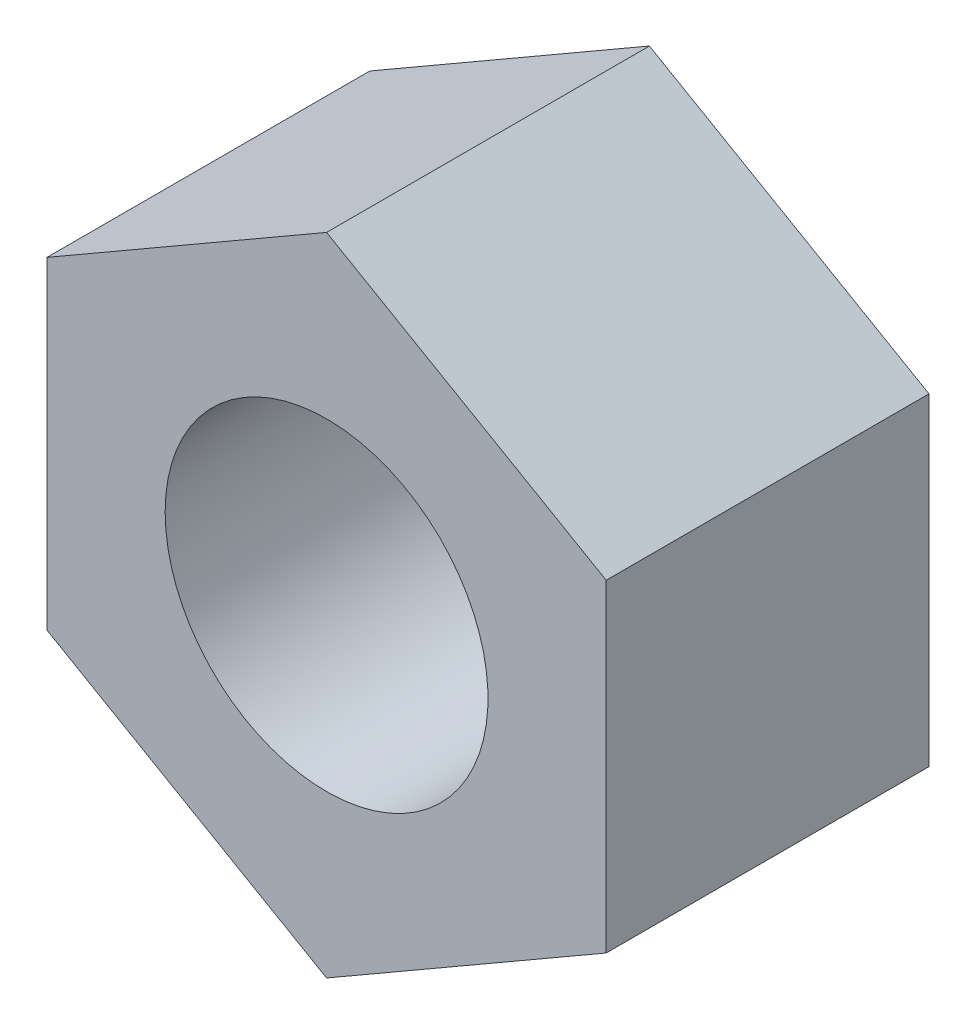
ISO-10303-21;
HEADER;
FILE_DESCRIPTION(('STEP AP214'),'2;1');
FILE_NAME('part.step','',(''),(''),'','','');
FILE_SCHEMA(('AUTOMOTIVE_DESIGN { 1 0 10303 214 1 1 1 1 }'));
ENDSEC;
DATA;
#1=APPLICATION_CONTEXT('core data for automotive mechanical design processes');
#2=APPLICATION_PROTOCOL_DEFINITION('international standard','automotive_design',2000,#1);
#3=PRODUCT_CONTEXT('',#1,'mechanical');
#4=PRODUCT('Part','Part','',(#3));
#5=PRODUCT_RELATED_PRODUCT_CATEGORY('part','',(#4));
#6=PRODUCT_DEFINITION_FORMATION('','',#4);
#7=PRODUCT_DEFINITION_CONTEXT('part definition',#1,'design');
#8=PRODUCT_DEFINITION('design','',#6,#7);
#9=PRODUCT_DEFINITION_SHAPE('','',#8);
#10=(LENGTH_UNIT() NAMED_UNIT(*) SI_UNIT(.MILLI.,.METRE.));
#11=(NAMED_UNIT(*) PLANE_ANGLE_UNIT() SI_UNIT($,.RADIAN.));
#12=(NAMED_UNIT(*) SI_UNIT($,.STERADIAN.) SOLID_ANGLE_UNIT());
#13=UNCERTAINTY_MEASURE_WITH_UNIT(LENGTH_MEASURE(1.E-05),#10,'distance_accuracy_value','');
#14=(GEOMETRIC_REPRESENTATION_CONTEXT(3) GLOBAL_UNCERTAINTY_ASSIGNED_CONTEXT((#13)) GLOBAL_UNIT_ASSIGNED_CONTEXT((#10,
#11,#12)) REPRESENTATION_CONTEXT('',''));
#15=CARTESIAN_POINT('',(0.,0.,0.));
#16=DIRECTION('',(0.,0.,1.));
#17=DIRECTION('',(1.,0.,0.));
#18=AXIS2_PLACEMENT_3D('',#15,#16,#17);
#19=CARTESIAN_POINT('',(-2.598076211,-3.036,3.));
#20=DIRECTION('',(0.,0.,1.));
#21=DIRECTION('',(1.,0.,0.));
#22=AXIS2_PLACEMENT_3D('',#19,#20,#21);
#23=PLANE('',#22);
#24=DIRECTION('',(0.,1.,0.));
#25=VECTOR('',#24,1.);
#26=CARTESIAN_POINT('',(-2.598076211,-1.5,3.));
#27=LINE('',#26,#25);
#28=CARTESIAN_POINT('',(-2.59807621108054,1.4999999998605,3.));
#29=VERTEX_POINT('',#28);
#30=CARTESIAN_POINT('',(-2.598076211,-1.499999999721,3.));
#31=VERTEX_POINT('',#30);
#32=EDGE_CURVE('E113',#29,#31,#27,.F.);
#33=ORIENTED_EDGE('',*,*,#32,.T.);
#34=DIRECTION('',(-0.866025403754996,0.500000000050997,0.));
#35=VECTOR('',#34,1.);
#36=CARTESIAN_POINT('',(0.,-3.,3.));
#37=LINE('',#36,#35);
#38=CARTESIAN_POINT('',(-3.22161380455283E-10,-2.9999999995815,3.));
#39=VERTEX_POINT('',#38);
#40=EDGE_CURVE('E108',#31,#39,#37,.F.);
#41=ORIENTED_EDGE('',*,*,#40,.T.);
#42=DIRECTION('',(-0.866025403754996,-0.500000000050997,0.));
#43=VECTOR('',#42,1.);
#44=CARTESIAN_POINT('',(2.598076211,-1.5,3.));
#45=LINE('',#44,#43);
#46=CARTESIAN_POINT('',(2.59807621108054,-1.4999999998605,3.));
#47=VERTEX_POINT('',#46);
#48=EDGE_CURVE('E103',#39,#47,#45,.F.);
#49=ORIENTED_EDGE('',*,*,#48,.T.);
#50=DIRECTION('',(0.,1.,0.));
#51=VECTOR('',#50,1.);
#52=CARTESIAN_POINT('',(2.598076211,1.5,3.));
#53=LINE('',#52,#51);
#54=CARTESIAN_POINT('',(2.598076211,1.499999999721,3.));
#55=VERTEX_POINT('',#54);
#56=EDGE_CURVE('E72',#47,#55,#53,.T.);
#57=ORIENTED_EDGE('',*,*,#56,.T.);
#58=DIRECTION('',(0.866025403754996,-0.500000000050997,0.));
#59=VECTOR('',#58,1.);
#60=CARTESIAN_POINT('',(0.,3.,3.));
#61=LINE('',#60,#59);
#62=CARTESIAN_POINT('',(3.22161554575826E-10,2.9999999995815,3.));
#63=VERTEX_POINT('',#62);
#64=EDGE_CURVE('E70',#55,#63,#61,.F.);
#65=ORIENTED_EDGE('',*,*,#64,.T.);
#66=DIRECTION('',(0.866025403754996,0.500000000050997,0.));
#67=VECTOR('',#66,1.);
#68=CARTESIAN_POINT('',(-2.598076211,1.5,3.));
#69=LINE('',#68,#67);
#70=EDGE_CURVE('E67',#63,#29,#69,.F.);
#71=ORIENTED_EDGE('',*,*,#70,.T.);
#72=EDGE_LOOP('',(#33,#41,#49,#57,#65,#71));
#73=FACE_BOUND('',#72,.T.);
#74=CARTESIAN_POINT('',(0.,0.,3.));
#75=DIRECTION('',(0.,0.,-1.));
#76=DIRECTION('',(-1.,0.,0.));
#77=AXIS2_PLACEMENT_3D('',#74,#75,#76);
#78=CIRCLE('',#77,1.5);
#79=CARTESIAN_POINT('',(-1.5,0.,3.));
#80=VERTEX_POINT('',#79);
#81=EDGE_CURVE('E20',#80,#80,#78,.T.);
#82=ORIENTED_EDGE('',*,*,#81,.T.);
#83=EDGE_LOOP('',(#82));
#84=FACE_BOUND('',#83,.T.);
#85=ADVANCED_FACE('F17',(#73,#84),#23,.T.);
#86=CARTESIAN_POINT('',(0.,0.,3.));
#87=DIRECTION('',(0.,0.,-1.));
#88=DIRECTION('',(-1.,0.,0.));
#89=AXIS2_PLACEMENT_3D('',#86,#87,#88);
#90=CYLINDRICAL_SURFACE('',#89,1.5);
#91=ORIENTED_EDGE('',*,*,#81,.F.);
#92=EDGE_LOOP('',(#91));
#93=FACE_BOUND('',#92,.T.);
#94=CARTESIAN_POINT('',(0.,0.,0.));
#95=DIRECTION('',(0.,0.,-1.));
#96=DIRECTION('',(-1.,0.,0.));
#97=AXIS2_PLACEMENT_3D('',#94,#95,#96);
#98=CIRCLE('',#97,1.5);
#99=CARTESIAN_POINT('',(-1.5,0.,0.));
#100=VERTEX_POINT('',#99);
#101=EDGE_CURVE('E91',#100,#100,#98,.T.);
#102=ORIENTED_EDGE('',*,*,#101,.T.);
#103=EDGE_LOOP('',(#102));
#104=FACE_BOUND('',#103,.T.);
#105=ADVANCED_FACE('F154',(#93,#104),#90,.F.);
#106=CARTESIAN_POINT('',(0.,3.,0.));
#107=DIRECTION('',(-0.500000000050997,-0.866025403754996,0.));
#108=DIRECTION('',(0.866025403754996,-0.500000000050997,0.));
#109=AXIS2_PLACEMENT_3D('',#106,#107,#108);
#110=PLANE('',#109);
#111=ORIENTED_EDGE('',*,*,#64,.F.);
#112=DIRECTION('',(0.,0.,1.));
#113=VECTOR('',#112,1.);
#114=CARTESIAN_POINT('',(2.598076211,1.499999999628,0.));
#115=LINE('',#114,#113);
#116=CARTESIAN_POINT('',(2.598076211,1.499999999907,0.));
#117=VERTEX_POINT('',#116);
#118=EDGE_CURVE('E93',#55,#117,#115,.F.);
#119=ORIENTED_EDGE('',*,*,#118,.T.);
#120=DIRECTION('',(-0.866025403754996,0.500000000050997,0.));
#121=VECTOR('',#120,1.);
#122=CARTESIAN_POINT('',(2.598076211,1.5,0.));
#123=LINE('',#122,#121);
#124=CARTESIAN_POINT('',(2.81891331438794E-10,2.99999999983725,0.));
#125=VERTEX_POINT('',#124);
#126=EDGE_CURVE('E88',#117,#125,#123,.T.);
#127=ORIENTED_EDGE('',*,*,#126,.T.);
#128=DIRECTION('',(0.,0.,1.));
#129=VECTOR('',#128,1.);
#130=CARTESIAN_POINT('',(0.,3.,0.));
#131=LINE('',#130,#129);
#132=EDGE_CURVE('E77',#125,#63,#131,.T.);
#133=ORIENTED_EDGE('',*,*,#132,.T.);
#134=EDGE_LOOP('',(#111,#119,#127,#133));
#135=FACE_BOUND('',#134,.T.);
#136=ADVANCED_FACE('F87',(#135),#110,.F.);
#137=CARTESIAN_POINT('',(-2.598076211,1.5,0.));
#138=DIRECTION('',(0.500000000050997,-0.866025403754996,0.));
#139=DIRECTION('',(0.866025403754996,0.500000000050997,0.));
#140=AXIS2_PLACEMENT_3D('',#137,#138,#139);
#141=PLANE('',#140);
#142=ORIENTED_EDGE('',*,*,#70,.F.);
#143=ORIENTED_EDGE('',*,*,#132,.F.);
#144=DIRECTION('',(-0.866025403754996,-0.500000000050997,0.));
#145=VECTOR('',#144,1.);
#146=CARTESIAN_POINT('',(0.,3.,0.));
#147=LINE('',#146,#145);
#148=CARTESIAN_POINT('',(-2.59807621108054,1.4999999999535,0.));
#149=VERTEX_POINT('',#148);
#150=EDGE_CURVE('E96',#125,#149,#147,.T.);
#151=ORIENTED_EDGE('',*,*,#150,.T.);
#152=DIRECTION('',(0.,0.,-1.));
#153=VECTOR('',#152,1.);
#154=CARTESIAN_POINT('',(-2.598076211,1.5,0.));
#155=LINE('',#154,#153);
#156=EDGE_CURVE('E84',#149,#29,#155,.F.);
#157=ORIENTED_EDGE('',*,*,#156,.T.);
#158=EDGE_LOOP('',(#142,#143,#151,#157));
#159=FACE_BOUND('',#158,.T.);
#160=ADVANCED_FACE('F81',(#159),#141,.F.);
#161=CARTESIAN_POINT('',(-2.598076211,-1.5,0.));
#162=DIRECTION('',(1.,0.,0.));
#163=DIRECTION('',(0.,0.,-1.));
#164=AXIS2_PLACEMENT_3D('',#161,#162,#163);
#165=PLANE('',#164);
#166=ORIENTED_EDGE('',*,*,#32,.F.);
#167=ORIENTED_EDGE('',*,*,#156,.F.);
#168=DIRECTION('',(0.,1.,0.));
#169=VECTOR('',#168,1.);
#170=CARTESIAN_POINT('',(-2.598076211,-3.036,0.));
#171=LINE('',#170,#169);
#172=CARTESIAN_POINT('',(-2.598076211,-1.499999999814,0.));
#173=VERTEX_POINT('',#172);
#174=EDGE_CURVE('E124',#149,#173,#171,.F.);
#175=ORIENTED_EDGE('',*,*,#174,.T.);
#176=DIRECTION('',(0.,0.,1.));
#177=VECTOR('',#176,1.);
#178=CARTESIAN_POINT('',(-2.598076211,-1.5,0.));
#179=LINE('',#178,#177);
#180=EDGE_CURVE('E110',#173,#31,#179,.T.);
#181=ORIENTED_EDGE('',*,*,#180,.T.);
#182=EDGE_LOOP('',(#166,#167,#175,#181));
#183=FACE_BOUND('',#182,.T.);
#184=ADVANCED_FACE('F122',(#183),#165,.F.);
#185=CARTESIAN_POINT('',(0.,-3.,0.));
#186=DIRECTION('',(0.500000000050997,0.866025403754996,0.));
#187=DIRECTION('',(-0.866025403754996,0.500000000050997,0.));
#188=AXIS2_PLACEMENT_3D('',#185,#186,#187);
#189=PLANE('',#188);
#190=ORIENTED_EDGE('',*,*,#40,.F.);
#191=ORIENTED_EDGE('',*,*,#180,.F.);
#192=DIRECTION('',(0.866025403754996,-0.500000000050997,0.));
#193=VECTOR('',#192,1.);
#194=CARTESIAN_POINT('',(-2.598076211,-1.5,0.));
#195=LINE('',#194,#193);
#196=CARTESIAN_POINT('',(-2.81890990494759E-10,-2.99999999983725,0.));
#197=VERTEX_POINT('',#196);
#198=EDGE_CURVE('E126',#173,#197,#195,.T.);
#199=ORIENTED_EDGE('',*,*,#198,.T.);
#200=DIRECTION('',(0.,0.,1.));
#201=VECTOR('',#200,1.);
#202=CARTESIAN_POINT('',(0.,-3.,0.));
#203=LINE('',#202,#201);
#204=EDGE_CURVE('E105',#197,#39,#203,.T.);
#205=ORIENTED_EDGE('',*,*,#204,.T.);
#206=EDGE_LOOP('',(#190,#191,#199,#205));
#207=FACE_BOUND('',#206,.T.);
#208=ADVANCED_FACE('F118',(#207),#189,.F.);
#209=CARTESIAN_POINT('',(2.598076211,-1.5,0.));
#210=DIRECTION('',(-0.500000000050997,0.866025403754996,0.));
#211=DIRECTION('',(-0.866025403754996,-0.500000000050997,0.));
#212=AXIS2_PLACEMENT_3D('',#209,#210,#211);
#213=PLANE('',#212);
#214=ORIENTED_EDGE('',*,*,#48,.F.);
#215=ORIENTED_EDGE('',*,*,#204,.F.);
#216=DIRECTION('',(0.866025403754996,0.500000000050997,0.));
#217=VECTOR('',#216,1.);
#218=CARTESIAN_POINT('',(0.,-3.,0.));
#219=LINE('',#218,#217);
#220=CARTESIAN_POINT('',(2.59807621108054,-1.4999999999535,0.));
#221=VERTEX_POINT('',#220);
#222=EDGE_CURVE('E26',#197,#221,#219,.T.);
#223=ORIENTED_EDGE('',*,*,#222,.T.);
#224=DIRECTION('',(0.,0.,1.));
#225=VECTOR('',#224,1.);
#226=CARTESIAN_POINT('',(2.598076211,-1.5,0.));
#227=LINE('',#226,#225);
#228=EDGE_CURVE('E34',#221,#47,#227,.T.);
#229=ORIENTED_EDGE('',*,*,#228,.T.);
#230=EDGE_LOOP('',(#214,#215,#223,#229));
#231=FACE_BOUND('',#230,.T.);
#232=ADVANCED_FACE('F133',(#231),#213,.F.);
#233=CARTESIAN_POINT('',(2.598076211,1.5,0.));
#234=DIRECTION('',(-1.,0.,0.));
#235=DIRECTION('',(0.,0.,1.));
#236=AXIS2_PLACEMENT_3D('',#233,#234,#235);
#237=PLANE('',#236);
#238=ORIENTED_EDGE('',*,*,#56,.F.);
#239=ORIENTED_EDGE('',*,*,#228,.F.);
#240=DIRECTION('',(0.,1.,0.));
#241=VECTOR('',#240,1.);
#242=CARTESIAN_POINT('',(2.598076211,-3.036,0.));
#243=LINE('',#242,#241);
#244=EDGE_CURVE('E11',#221,#117,#243,.T.);
#245=ORIENTED_EDGE('',*,*,#244,.T.);
#246=ORIENTED_EDGE('',*,*,#118,.F.);
#247=EDGE_LOOP('',(#238,#239,#245,#246));
#248=FACE_BOUND('',#247,.T.);
#249=ADVANCED_FACE('F136',(#248),#237,.F.);
#250=CARTESIAN_POINT('',(-2.598076211,-3.036,0.));
#251=DIRECTION('',(0.,0.,1.));
#252=DIRECTION('',(1.,0.,0.));
#253=AXIS2_PLACEMENT_3D('',#250,#251,#252);
#254=PLANE('',#253);
#255=ORIENTED_EDGE('',*,*,#222,.F.);
#256=ORIENTED_EDGE('',*,*,#198,.F.);
#257=ORIENTED_EDGE('',*,*,#174,.F.);
#258=ORIENTED_EDGE('',*,*,#150,.F.);
#259=ORIENTED_EDGE('',*,*,#126,.F.);
#260=ORIENTED_EDGE('',*,*,#244,.F.);
#261=EDGE_LOOP('',(#255,#256,#257,#258,#259,#260));
#262=FACE_BOUND('',#261,.T.);
#263=ORIENTED_EDGE('',*,*,#101,.F.);
#264=EDGE_LOOP('',(#263));
#265=FACE_BOUND('',#264,.T.);
#266=ADVANCED_FACE('F134',(#262,#265),#254,.F.);
#267=CLOSED_SHELL('',(#85,#105,#136,#160,#184,#208,#232,#249,#266));
#268=MANIFOLD_SOLID_BREP('B1',#267);
#269=ADVANCED_BREP_SHAPE_REPRESENTATION('',(#18,#268),#14);
#270=SHAPE_DEFINITION_REPRESENTATION(#9,#269);
ENDSEC;
END-ISO-10303-21;
